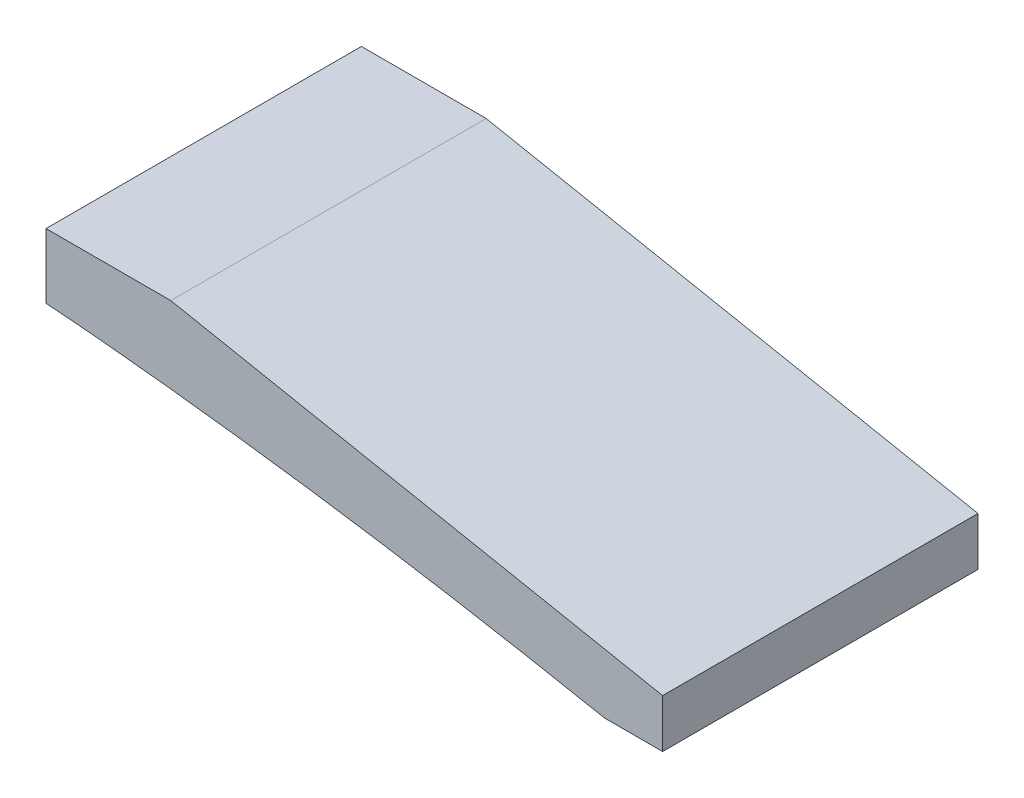
ISO-10303-21;
HEADER;
FILE_DESCRIPTION(('STEP AP214'),'2;1');
FILE_NAME('part.step','',(''),(''),'','','');
FILE_SCHEMA(('AUTOMOTIVE_DESIGN { 1 0 10303 214 1 1 1 1 }'));
ENDSEC;
DATA;
#1=APPLICATION_CONTEXT('core data for automotive mechanical design processes');
#2=APPLICATION_PROTOCOL_DEFINITION('international standard','automotive_design',2000,#1);
#3=PRODUCT_CONTEXT('',#1,'mechanical');
#4=PRODUCT('Part','Part','',(#3));
#5=PRODUCT_RELATED_PRODUCT_CATEGORY('part','',(#4));
#6=PRODUCT_DEFINITION_FORMATION('','',#4);
#7=PRODUCT_DEFINITION_CONTEXT('part definition',#1,'design');
#8=PRODUCT_DEFINITION('design','',#6,#7);
#9=PRODUCT_DEFINITION_SHAPE('','',#8);
#10=(LENGTH_UNIT() NAMED_UNIT(*) SI_UNIT(.MILLI.,.METRE.));
#11=(NAMED_UNIT(*) PLANE_ANGLE_UNIT() SI_UNIT($,.RADIAN.));
#12=(NAMED_UNIT(*) SI_UNIT($,.STERADIAN.) SOLID_ANGLE_UNIT());
#13=UNCERTAINTY_MEASURE_WITH_UNIT(LENGTH_MEASURE(1.E-05),#10,'distance_accuracy_value','');
#14=(GEOMETRIC_REPRESENTATION_CONTEXT(3) GLOBAL_UNCERTAINTY_ASSIGNED_CONTEXT((#13)) GLOBAL_UNIT_ASSIGNED_CONTEXT((#10,
#11,#12)) REPRESENTATION_CONTEXT('',''));
#15=CARTESIAN_POINT('',(0.,0.,0.));
#16=DIRECTION('',(0.,0.,1.));
#17=DIRECTION('',(1.,0.,0.));
#18=AXIS2_PLACEMENT_3D('',#15,#16,#17);
#19=CARTESIAN_POINT('',(115.213744416832,0.,0.));
#20=DIRECTION('',(1.,0.,0.));
#21=DIRECTION('',(0.,0.,-1.));
#22=AXIS2_PLACEMENT_3D('',#19,#20,#21);
#23=PLANE('',#22);
#24=DIRECTION('',(0.,0.,1.));
#25=VECTOR('',#24,1.);
#26=CARTESIAN_POINT('',(115.213744416832,24.2214112116771,205.14));
#27=LINE('',#26,#25);
#28=CARTESIAN_POINT('',(115.213744416832,24.2214112116771,270.21000000002));
#29=VERTEX_POINT('',#28);
#30=CARTESIAN_POINT('',(115.21374559276,24.2213952592599,335.28));
#31=VERTEX_POINT('',#30);
#32=EDGE_CURVE('E111',#29,#31,#27,.T.);
#33=ORIENTED_EDGE('',*,*,#32,.T.);
#34=DIRECTION('',(0.,1.,0.));
#35=VECTOR('',#34,1.);
#36=CARTESIAN_POINT('',(115.213744416832,24.3638893709826,335.28));
#37=LINE('',#36,#35);
#38=CARTESIAN_POINT('',(115.213744416832,37.5748056815849,335.28));
#39=VERTEX_POINT('',#38);
#40=EDGE_CURVE('E99',#31,#39,#37,.T.);
#41=ORIENTED_EDGE('',*,*,#40,.T.);
#42=DIRECTION('',(0.,0.,-1.));
#43=VECTOR('',#42,1.);
#44=CARTESIAN_POINT('',(115.213744416832,37.5748056815849,-181.33638570651));
#45=LINE('',#44,#43);
#46=CARTESIAN_POINT('',(115.213744416832,37.5748056815849,270.21000000002));
#47=VERTEX_POINT('',#46);
#48=EDGE_CURVE('E172',#39,#47,#45,.T.);
#49=ORIENTED_EDGE('',*,*,#48,.T.);
#50=DIRECTION('',(0.,1.,0.));
#51=VECTOR('',#50,1.);
#52=CARTESIAN_POINT('',(115.213744416832,0.,270.21));
#53=LINE('',#52,#51);
#54=EDGE_CURVE('E108',#29,#47,#53,.T.);
#55=ORIENTED_EDGE('',*,*,#54,.F.);
#56=EDGE_LOOP('',(#33,#41,#49,#55));
#57=FACE_BOUND('',#56,.T.);
#58=ADVANCED_FACE('F42',(#57),#23,.F.);
#59=CARTESIAN_POINT('',(0.,0.,270.21));
#60=DIRECTION('',(0.,0.,1.));
#61=DIRECTION('',(1.,0.,0.));
#62=AXIS2_PLACEMENT_3D('',#59,#60,#61);
#63=PLANE('',#62);
#64=CARTESIAN_POINT('',(1.08543845998878E-06,6.34986905179703,270.21));
#65=CARTESIAN_POINT('',(1.08543845663706E-06,8.6306100877507,270.21));
#66=CARTESIAN_POINT('',(3.36638828292608,12.3374371960403,270.21));
#67=CARTESIAN_POINT('',(9.09524689591066,15.5028954811346,270.21));
#68=CARTESIAN_POINT('',(15.7464973845585,18.0443264103655,270.21));
#69=CARTESIAN_POINT('',(23.5489505384108,20.1171636996051,270.21));
#70=CARTESIAN_POINT('',(33.812501528953,22.3101259062739,270.21));
#71=CARTESIAN_POINT('',(46.6345958904755,24.0543980595611,270.21));
#72=CARTESIAN_POINT('',(61.9927568045159,25.214913978264,270.21));
#73=CARTESIAN_POINT('',(77.2944885048751,25.6577826389007,270.21));
#74=CARTESIAN_POINT('',(97.6387170655567,25.447601323062,270.21));
#75=CARTESIAN_POINT('',(123.023871102193,23.8279459288781,270.21));
#76=CARTESIAN_POINT('',(153.375300958893,20.4499268281831,270.21));
#77=CARTESIAN_POINT('',(183.689201275917,16.212370905392,270.21));
#78=CARTESIAN_POINT('',(209.357055926016,11.7913739435886,270.21));
#79=CARTESIAN_POINT('',(224.920112537199,8.82060745314526,270.21));
#80=CARTESIAN_POINT('',(230.427487748225,7.73365163376837,270.21));
#81=B_SPLINE_CURVE_WITH_KNOTS('',3,(#64,#65,#66,#67,#68,#69,#70,#71,#72,#73,#74,#75,#76,#77,#78,
#79,#80),.UNSPECIFIED.,.F.,.F.,(4,1,1,1,1,1,1,1,1,1,1,1,1,1,4),(0.500036340523268,
0.51188539229133,0.519270103944396,0.532743107178736,0.545659693699004,0.55835093759763,
0.583334716790265,0.608058308959296,0.632657887044315,0.657196790820692,0.706232938012733,
0.755344342157393,0.80456841599826,0.853943192704259,0.881036761694876),.UNSPECIFIED.);
#82=CARTESIAN_POINT('',(230.427487748225,7.73365163376839,270.21));
#83=VERTEX_POINT('',#82);
#84=EDGE_CURVE('E114',#83,#29,#81,.F.);
#85=ORIENTED_EDGE('',*,*,#84,.T.);
#86=ORIENTED_EDGE('',*,*,#54,.T.);
#87=DIRECTION('',(1.,0.,0.));
#88=VECTOR('',#87,1.);
#89=CARTESIAN_POINT('',(80.9563528866809,37.574805681585,270.21));
#90=LINE('',#89,#88);
#91=CARTESIAN_POINT('',(140.956352886681,37.5748056815851,270.21));
#92=VERTEX_POINT('',#91);
#93=EDGE_CURVE('E115',#47,#92,#90,.T.);
#94=ORIENTED_EDGE('',*,*,#93,.T.);
#95=DIRECTION('',(0.981414326191585,-0.19190080861194,0.));
#96=VECTOR('',#95,1.);
#97=CARTESIAN_POINT('',(140.956352886681,37.5748056815851,270.21));
#98=LINE('',#97,#96);
#99=CARTESIAN_POINT('',(242.427487748225,17.7336516337684,270.21));
#100=VERTEX_POINT('',#99);
#101=EDGE_CURVE('E165',#92,#100,#98,.T.);
#102=ORIENTED_EDGE('',*,*,#101,.T.);
#103=DIRECTION('',(0.,-1.,0.));
#104=VECTOR('',#103,1.);
#105=CARTESIAN_POINT('',(242.427487748225,7.73365163376839,270.21));
#106=LINE('',#105,#104);
#107=CARTESIAN_POINT('',(242.427487748225,7.73365163376839,270.21));
#108=VERTEX_POINT('',#107);
#109=EDGE_CURVE('E173',#100,#108,#106,.T.);
#110=ORIENTED_EDGE('',*,*,#109,.T.);
#111=DIRECTION('',(-1.,0.,0.));
#112=VECTOR('',#111,1.);
#113=CARTESIAN_POINT('',(230.427487748225,7.73365163376839,270.21));
#114=LINE('',#113,#112);
#115=EDGE_CURVE('E107',#108,#83,#114,.T.);
#116=ORIENTED_EDGE('',*,*,#115,.T.);
#117=EDGE_LOOP('',(#85,#86,#94,#102,#110,#116));
#118=FACE_BOUND('',#117,.T.);
#119=ADVANCED_FACE('F146',(#118),#63,.F.);
#120=CARTESIAN_POINT('',(80.9563528866809,37.574805681585,-181.33638570651));
#121=DIRECTION('',(0.,1.,0.));
#122=DIRECTION('',(-1.,0.,0.));
#123=AXIS2_PLACEMENT_3D('',#120,#121,#122);
#124=PLANE('',#123);
#125=ORIENTED_EDGE('',*,*,#93,.F.);
#126=ORIENTED_EDGE('',*,*,#48,.F.);
#127=DIRECTION('',(-1.,0.,0.));
#128=VECTOR('',#127,1.);
#129=CARTESIAN_POINT('',(80.9563528866809,37.574805681585,335.28));
#130=LINE('',#129,#128);
#131=CARTESIAN_POINT('',(140.956352886681,37.5748056815851,335.28));
#132=VERTEX_POINT('',#131);
#133=EDGE_CURVE('E105',#132,#39,#130,.T.);
#134=ORIENTED_EDGE('',*,*,#133,.F.);
#135=DIRECTION('',(0.,0.,1.));
#136=VECTOR('',#135,1.);
#137=CARTESIAN_POINT('',(140.956352886681,37.5748056815851,-181.33638570651));
#138=LINE('',#137,#136);
#139=EDGE_CURVE('E169',#92,#132,#138,.T.);
#140=ORIENTED_EDGE('',*,*,#139,.F.);
#141=EDGE_LOOP('',(#125,#126,#134,#140));
#142=FACE_BOUND('',#141,.T.);
#143=ADVANCED_FACE('F142',(#142),#124,.T.);
#144=CARTESIAN_POINT('',(140.956352886681,37.5748056815851,-181.33638570651));
#145=DIRECTION('',(0.19190080861194,0.981414326191586,0.));
#146=DIRECTION('',(-0.981414326191585,0.19190080861194,0.));
#147=AXIS2_PLACEMENT_3D('',#144,#145,#146);
#148=PLANE('',#147);
#149=ORIENTED_EDGE('',*,*,#101,.F.);
#150=ORIENTED_EDGE('',*,*,#139,.T.);
#151=DIRECTION('',(-0.981414326191586,0.19190080861194,0.));
#152=VECTOR('',#151,1.);
#153=CARTESIAN_POINT('',(140.956352886681,37.5748056815851,335.28));
#154=LINE('',#153,#152);
#155=CARTESIAN_POINT('',(242.427487748225,17.7336516337684,335.28));
#156=VERTEX_POINT('',#155);
#157=EDGE_CURVE('E191',#156,#132,#154,.T.);
#158=ORIENTED_EDGE('',*,*,#157,.F.);
#159=DIRECTION('',(0.,0.,1.));
#160=VECTOR('',#159,1.);
#161=CARTESIAN_POINT('',(242.427487748225,17.7336516337684,-181.33638570651));
#162=LINE('',#161,#160);
#163=EDGE_CURVE('E170',#100,#156,#162,.T.);
#164=ORIENTED_EDGE('',*,*,#163,.F.);
#165=EDGE_LOOP('',(#149,#150,#158,#164));
#166=FACE_BOUND('',#165,.T.);
#167=ADVANCED_FACE('F145',(#166),#148,.T.);
#168=CARTESIAN_POINT('',(242.427487748225,7.73365163376839,-181.33638570651));
#169=DIRECTION('',(1.,0.,0.));
#170=DIRECTION('',(0.,0.,-1.));
#171=AXIS2_PLACEMENT_3D('',#168,#169,#170);
#172=PLANE('',#171);
#173=ORIENTED_EDGE('',*,*,#109,.F.);
#174=ORIENTED_EDGE('',*,*,#163,.T.);
#175=DIRECTION('',(0.,1.,0.));
#176=VECTOR('',#175,1.);
#177=CARTESIAN_POINT('',(242.427487748225,7.73365163376839,335.28));
#178=LINE('',#177,#176);
#179=CARTESIAN_POINT('',(242.427487748225,7.73365163376839,335.28));
#180=VERTEX_POINT('',#179);
#181=EDGE_CURVE('E192',#180,#156,#178,.T.);
#182=ORIENTED_EDGE('',*,*,#181,.F.);
#183=DIRECTION('',(0.,0.,1.));
#184=VECTOR('',#183,1.);
#185=CARTESIAN_POINT('',(242.427487748225,7.73365163376839,-181.33638570651));
#186=LINE('',#185,#184);
#187=EDGE_CURVE('E66',#108,#180,#186,.T.);
#188=ORIENTED_EDGE('',*,*,#187,.F.);
#189=EDGE_LOOP('',(#173,#174,#182,#188));
#190=FACE_BOUND('',#189,.T.);
#191=ADVANCED_FACE('F155',(#190),#172,.T.);
#192=CARTESIAN_POINT('',(230.427487748225,7.73365163376839,-181.33638570651));
#193=DIRECTION('',(0.,-1.,0.));
#194=DIRECTION('',(1.,0.,0.));
#195=AXIS2_PLACEMENT_3D('',#192,#193,#194);
#196=PLANE('',#195);
#197=ORIENTED_EDGE('',*,*,#115,.F.);
#198=ORIENTED_EDGE('',*,*,#187,.T.);
#199=DIRECTION('',(1.,0.,0.));
#200=VECTOR('',#199,1.);
#201=CARTESIAN_POINT('',(230.427487748225,7.73365163376839,335.28));
#202=LINE('',#201,#200);
#203=CARTESIAN_POINT('',(230.427487748225,7.73365163376839,335.28));
#204=VERTEX_POINT('',#203);
#205=EDGE_CURVE('E52',#204,#180,#202,.T.);
#206=ORIENTED_EDGE('',*,*,#205,.F.);
#207=DIRECTION('',(0.,0.,1.));
#208=VECTOR('',#207,1.);
#209=CARTESIAN_POINT('',(230.427487748225,7.73365163376839,-181.33638570651));
#210=LINE('',#209,#208);
#211=EDGE_CURVE('E59',#83,#204,#210,.T.);
#212=ORIENTED_EDGE('',*,*,#211,.F.);
#213=EDGE_LOOP('',(#197,#198,#206,#212));
#214=FACE_BOUND('',#213,.T.);
#215=ADVANCED_FACE('F141',(#214),#196,.T.);
#216=CARTESIAN_POINT('',(1.08543845998878E-06,6.34986905179703,-181.33638570651));
#217=CARTESIAN_POINT('',(1.08543845663706E-06,8.6306100877507,-181.33638570651));
#218=CARTESIAN_POINT('',(3.36638828292608,12.3374371960403,-181.33638570651));
#219=CARTESIAN_POINT('',(9.09524689591066,15.5028954811346,-181.33638570651));
#220=CARTESIAN_POINT('',(15.7464973845585,18.0443264103655,-181.33638570651));
#221=CARTESIAN_POINT('',(23.5489505384108,20.1171636996051,-181.33638570651));
#222=CARTESIAN_POINT('',(33.812501528953,22.3101259062739,-181.33638570651));
#223=CARTESIAN_POINT('',(46.6345958904755,24.0543980595611,-181.33638570651));
#224=CARTESIAN_POINT('',(61.9927568045159,25.214913978264,-181.33638570651));
#225=CARTESIAN_POINT('',(77.2944885048751,25.6577826389007,-181.33638570651));
#226=CARTESIAN_POINT('',(97.6387170655567,25.447601323062,-181.33638570651));
#227=CARTESIAN_POINT('',(123.023871102193,23.8279459288781,-181.33638570651));
#228=CARTESIAN_POINT('',(153.375300958893,20.4499268281831,-181.33638570651));
#229=CARTESIAN_POINT('',(183.689201275917,16.212370905392,-181.33638570651));
#230=CARTESIAN_POINT('',(209.357055926016,11.7913739435886,-181.33638570651));
#231=CARTESIAN_POINT('',(224.920112537199,8.82060745314526,-181.33638570651));
#232=CARTESIAN_POINT('',(230.427487748225,7.73365163376837,-181.33638570651));
#233=B_SPLINE_CURVE_WITH_KNOTS('',3,(#216,#217,#218,#219,#220,#221,#222,#223,#224,#225,#226,
#227,#228,#229,#230,#231,#232),.UNSPECIFIED.,.F.,.F.,(4,1,1,1,1,1,1,1,1,1,1,1,1,1,4),
(0.500036340523268,0.51188539229133,0.519270103944396,0.532743107178736,0.545659693699004,
0.55835093759763,0.583334716790265,0.608058308959296,0.632657887044315,0.657196790820692,
0.706232938012733,0.755344342157393,0.80456841599826,0.853943192704259,0.881036761694876),.UNSPECIFIED.);
#234=DIRECTION('',(0.,0.,1.));
#235=VECTOR('',#234,1.);
#236=SURFACE_OF_LINEAR_EXTRUSION('',#233,#235);
#237=ORIENTED_EDGE('',*,*,#84,.F.);
#238=ORIENTED_EDGE('',*,*,#211,.T.);
#239=CARTESIAN_POINT('',(230.427487748225,7.73365163376837,335.28));
#240=CARTESIAN_POINT('',(224.920112537199,8.82060745314526,335.28));
#241=CARTESIAN_POINT('',(209.357055926016,11.7913739435886,335.28));
#242=CARTESIAN_POINT('',(183.689201275917,16.212370905392,335.28));
#243=CARTESIAN_POINT('',(153.375300958893,20.4499268281831,335.28));
#244=CARTESIAN_POINT('',(130.540077630274,22.9914156785241,335.28));
#245=CARTESIAN_POINT('',(117.805487611664,24.0281600225508,335.28));
#246=CARTESIAN_POINT('',(115.21374676916,24.2214110362777,335.28));
#247=B_SPLINE_CURVE_WITH_KNOTS('',3,(#239,#240,#241,#242,#243,#244,#245,#246),.UNSPECIFIED.,.F.,
.F.,(4,1,1,1,1,4),(0.693691795386979,0.720785364377596,0.770160141083595,0.819384214924463,
0.868495619069123,0.881036761694876),.UNSPECIFIED.);
#248=EDGE_CURVE('E11',#31,#204,#247,.F.);
#249=ORIENTED_EDGE('',*,*,#248,.F.);
#250=ORIENTED_EDGE('',*,*,#32,.F.);
#251=EDGE_LOOP('',(#237,#238,#249,#250));
#252=FACE_BOUND('',#251,.T.);
#253=ADVANCED_FACE('F118',(#252),#236,.T.);
#254=CARTESIAN_POINT('',(113.257320935499,24.3638893709826,335.28));
#255=DIRECTION('',(0.,0.,1.));
#256=DIRECTION('',(1.,0.,0.));
#257=AXIS2_PLACEMENT_3D('',#254,#255,#256);
#258=PLANE('',#257);
#259=ORIENTED_EDGE('',*,*,#40,.F.);
#260=ORIENTED_EDGE('',*,*,#248,.T.);
#261=ORIENTED_EDGE('',*,*,#205,.T.);
#262=ORIENTED_EDGE('',*,*,#181,.T.);
#263=ORIENTED_EDGE('',*,*,#157,.T.);
#264=ORIENTED_EDGE('',*,*,#133,.T.);
#265=EDGE_LOOP('',(#259,#260,#261,#262,#263,#264));
#266=FACE_BOUND('',#265,.T.);
#267=ADVANCED_FACE('F44',(#266),#258,.T.);
#268=CLOSED_SHELL('',(#58,#119,#143,#167,#191,#215,#253,#267));
#269=MANIFOLD_SOLID_BREP('B2',#268);
#270=ADVANCED_BREP_SHAPE_REPRESENTATION('',(#18,#269),#14);
#271=SHAPE_DEFINITION_REPRESENTATION(#9,#270);
ENDSEC;
END-ISO-10303-21;
